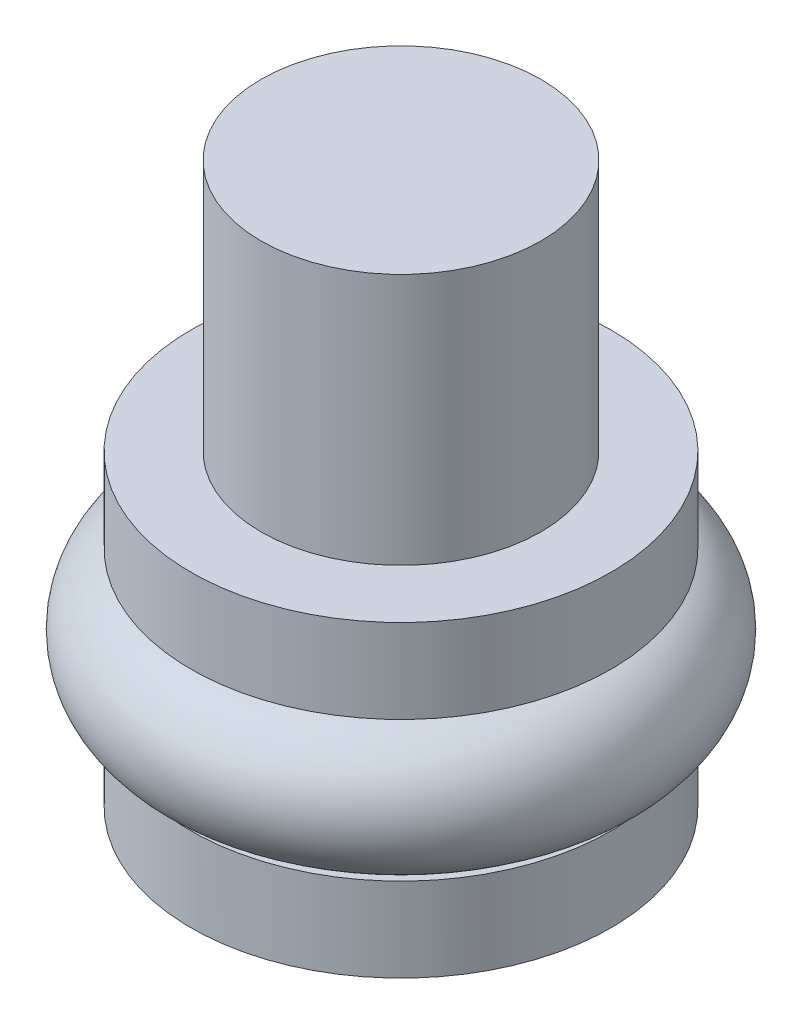
ISO-10303-21;
HEADER;
FILE_DESCRIPTION(('STEP AP214'),'2;1');
FILE_NAME('part.step','',(''),(''),'','','');
FILE_SCHEMA(('AUTOMOTIVE_DESIGN { 1 0 10303 214 1 1 1 1 }'));
ENDSEC;
DATA;
#1=APPLICATION_CONTEXT('core data for automotive mechanical design processes');
#2=APPLICATION_PROTOCOL_DEFINITION('international standard','automotive_design',2000,#1);
#3=PRODUCT_CONTEXT('',#1,'mechanical');
#4=PRODUCT('Part','Part','',(#3));
#5=PRODUCT_RELATED_PRODUCT_CATEGORY('part','',(#4));
#6=PRODUCT_DEFINITION_FORMATION('','',#4);
#7=PRODUCT_DEFINITION_CONTEXT('part definition',#1,'design');
#8=PRODUCT_DEFINITION('design','',#6,#7);
#9=PRODUCT_DEFINITION_SHAPE('','',#8);
#10=(LENGTH_UNIT() NAMED_UNIT(*) SI_UNIT(.MILLI.,.METRE.));
#11=(NAMED_UNIT(*) PLANE_ANGLE_UNIT() SI_UNIT($,.RADIAN.));
#12=(NAMED_UNIT(*) SI_UNIT($,.STERADIAN.) SOLID_ANGLE_UNIT());
#13=UNCERTAINTY_MEASURE_WITH_UNIT(LENGTH_MEASURE(1.E-05),#10,'distance_accuracy_value','');
#14=(GEOMETRIC_REPRESENTATION_CONTEXT(3) GLOBAL_UNCERTAINTY_ASSIGNED_CONTEXT((#13)) GLOBAL_UNIT_ASSIGNED_CONTEXT((#10,
#11,#12)) REPRESENTATION_CONTEXT('',''));
#15=CARTESIAN_POINT('',(0.,0.,0.));
#16=DIRECTION('',(0.,0.,1.));
#17=DIRECTION('',(1.,0.,0.));
#18=AXIS2_PLACEMENT_3D('',#15,#16,#17);
#19=CARTESIAN_POINT('',(0.,-11.,0.));
#20=DIRECTION('',(0.,1.,0.));
#21=DIRECTION('',(0.,0.,1.));
#22=AXIS2_PLACEMENT_3D('',#19,#20,#21);
#23=CYLINDRICAL_SURFACE('',#22,7.5);
#24=CARTESIAN_POINT('',(0.,-11.,0.));
#25=DIRECTION('',(0.,-1.,0.));
#26=DIRECTION('',(0.,0.,-1.));
#27=AXIS2_PLACEMENT_3D('',#24,#25,#26);
#28=CIRCLE('',#27,7.5);
#29=CARTESIAN_POINT('',(0.,-11.,-7.5));
#30=VERTEX_POINT('',#29);
#31=EDGE_CURVE('E12',#30,#30,#28,.T.);
#32=ORIENTED_EDGE('',*,*,#31,.F.);
#33=EDGE_LOOP('',(#32));
#34=FACE_BOUND('',#33,.T.);
#35=CARTESIAN_POINT('',(0.,-8.,0.));
#36=DIRECTION('',(0.,-1.,0.));
#37=DIRECTION('',(0.,0.,-1.));
#38=AXIS2_PLACEMENT_3D('',#35,#36,#37);
#39=CIRCLE('',#38,7.5);
#40=CARTESIAN_POINT('',(0.,-8.,-7.5));
#41=VERTEX_POINT('',#40);
#42=EDGE_CURVE('E45',#41,#41,#39,.T.);
#43=ORIENTED_EDGE('',*,*,#42,.T.);
#44=EDGE_LOOP('',(#43));
#45=FACE_BOUND('',#44,.T.);
#46=ADVANCED_FACE('F42',(#34,#45),#23,.T.);
#47=CARTESIAN_POINT('',(0.,-8.,0.));
#48=DIRECTION('',(0.,-1.,0.));
#49=DIRECTION('',(0.,0.,-1.));
#50=AXIS2_PLACEMENT_3D('',#47,#48,#49);
#51=PLANE('',#50);
#52=ORIENTED_EDGE('',*,*,#42,.F.);
#53=EDGE_LOOP('',(#52));
#54=FACE_BOUND('',#53,.T.);
#55=ADVANCED_FACE('F53',(#54),#51,.F.);
#56=CARTESIAN_POINT('',(0.,-13.,0.));
#57=DIRECTION('',(0.,1.,0.));
#58=DIRECTION('',(-1.,0.,0.));
#59=AXIS2_PLACEMENT_3D('',#56,#57,#58);
#60=CONICAL_SURFACE('',#59,0.,1.31019393504756);
#61=ORIENTED_EDGE('',*,*,#31,.T.);
#62=EDGE_LOOP('',(#61));
#63=FACE_BOUND('',#62,.T.);
#64=CARTESIAN_POINT('',(0.,-13.,0.));
#65=VERTEX_POINT('',#64);
#66=VERTEX_LOOP('',#65);
#67=FACE_BOUND('',#66,.T.);
#68=ADVANCED_FACE('F51',(#63,#67),#60,.T.);
#69=CLOSED_SHELL('',(#46,#55,#68));
#70=MANIFOLD_SOLID_BREP('B2',#69);
#71=CARTESIAN_POINT('',(0.,-5.5,0.));
#72=DIRECTION('',(0.,-1.,0.));
#73=DIRECTION('',(0.,0.,-1.));
#74=AXIS2_PLACEMENT_3D('',#71,#72,#73);
#75=TOROIDAL_SURFACE('',#74,6.5,2.46111070557315);
#76=CARTESIAN_POINT('',(0.,-5.5,6.5));
#77=DIRECTION('',(1.,0.,0.));
#78=DIRECTION('',(0.,0.,-1.));
#79=AXIS2_PLACEMENT_3D('',#76,#77,#78);
#80=CIRCLE('',#79,2.46111070557315);
#81=CARTESIAN_POINT('',(0.,-5.5,8.96111070557315));
#82=VERTEX_POINT('',#81);
#83=EDGE_CURVE('E41',#82,#82,#80,.T.);
#84=CARTESIAN_POINT('',(0.,-5.5,0.));
#85=DIRECTION('',(0.,-1.,0.));
#86=DIRECTION('',(0.,0.,-1.));
#87=AXIS2_PLACEMENT_3D('',#84,#85,#86);
#88=CIRCLE('',#87,8.96111070557315);
#89=EDGE_CURVE('',#82,#82,#88,.T.);
#90=ORIENTED_EDGE('',*,*,#83,.F.);
#91=ORIENTED_EDGE('',*,*,#83,.T.);
#92=ORIENTED_EDGE('',*,*,#89,.T.);
#93=ORIENTED_EDGE('',*,*,#89,.F.);
#94=EDGE_LOOP('',(#90,#92,#91,#93));
#95=FACE_BOUND('',#94,.T.);
#96=ADVANCED_FACE('F92',(#95),#75,.T.);
#97=CLOSED_SHELL('',(#96));
#98=MANIFOLD_SOLID_BREP('B6',#97);
#99=CARTESIAN_POINT('',(0.,9.,0.));
#100=DIRECTION('',(0.,-1.,0.));
#101=DIRECTION('',(0.,0.,-1.));
#102=AXIS2_PLACEMENT_3D('',#99,#100,#101);
#103=CYLINDRICAL_SURFACE('',#102,5.);
#104=CARTESIAN_POINT('',(0.,9.,0.));
#105=DIRECTION('',(0.,1.,0.));
#106=DIRECTION('',(0.,0.,1.));
#107=AXIS2_PLACEMENT_3D('',#104,#105,#106);
#108=CIRCLE('',#107,5.);
#109=CARTESIAN_POINT('',(0.,9.,5.));
#110=VERTEX_POINT('',#109);
#111=EDGE_CURVE('E91',#110,#110,#108,.T.);
#112=ORIENTED_EDGE('',*,*,#111,.F.);
#113=EDGE_LOOP('',(#112));
#114=FACE_BOUND('',#113,.T.);
#115=CARTESIAN_POINT('',(0.,0.,0.));
#116=DIRECTION('',(0.,-1.,0.));
#117=DIRECTION('',(0.,0.,-1.));
#118=AXIS2_PLACEMENT_3D('',#115,#116,#117);
#119=CIRCLE('',#118,5.);
#120=CARTESIAN_POINT('',(0.,0.,-5.));
#121=VERTEX_POINT('',#120);
#122=EDGE_CURVE('E115',#121,#121,#119,.T.);
#123=ORIENTED_EDGE('',*,*,#122,.F.);
#124=EDGE_LOOP('',(#123));
#125=FACE_BOUND('',#124,.T.);
#126=ADVANCED_FACE('F109',(#114,#125),#103,.T.);
#127=CARTESIAN_POINT('',(0.,9.,0.));
#128=DIRECTION('',(0.,1.,0.));
#129=DIRECTION('',(0.,0.,1.));
#130=AXIS2_PLACEMENT_3D('',#127,#128,#129);
#131=PLANE('',#130);
#132=ORIENTED_EDGE('',*,*,#111,.T.);
#133=EDGE_LOOP('',(#132));
#134=FACE_BOUND('',#133,.T.);
#135=ADVANCED_FACE('F142',(#134),#131,.T.);
#136=CARTESIAN_POINT('',(0.,-3.,0.));
#137=DIRECTION('',(0.,1.,0.));
#138=DIRECTION('',(0.,0.,1.));
#139=AXIS2_PLACEMENT_3D('',#136,#137,#138);
#140=CYLINDRICAL_SURFACE('',#139,7.5);
#141=CARTESIAN_POINT('',(0.,-3.,0.));
#142=DIRECTION('',(0.,-1.,0.));
#143=DIRECTION('',(0.,0.,-1.));
#144=AXIS2_PLACEMENT_3D('',#141,#142,#143);
#145=CIRCLE('',#144,7.5);
#146=CARTESIAN_POINT('',(0.,-3.,-7.5));
#147=VERTEX_POINT('',#146);
#148=EDGE_CURVE('E119',#147,#147,#145,.T.);
#149=ORIENTED_EDGE('',*,*,#148,.F.);
#150=EDGE_LOOP('',(#149));
#151=FACE_BOUND('',#150,.T.);
#152=CARTESIAN_POINT('',(0.,0.,0.));
#153=DIRECTION('',(0.,-1.,0.));
#154=DIRECTION('',(0.,0.,-1.));
#155=AXIS2_PLACEMENT_3D('',#152,#153,#154);
#156=CIRCLE('',#155,7.5);
#157=CARTESIAN_POINT('',(0.,0.,-7.5));
#158=VERTEX_POINT('',#157);
#159=EDGE_CURVE('E123',#158,#158,#156,.T.);
#160=ORIENTED_EDGE('',*,*,#159,.T.);
#161=EDGE_LOOP('',(#160));
#162=FACE_BOUND('',#161,.T.);
#163=ADVANCED_FACE('F129',(#151,#162),#140,.T.);
#164=CARTESIAN_POINT('',(0.,-3.,0.));
#165=DIRECTION('',(0.,-1.,0.));
#166=DIRECTION('',(0.,0.,-1.));
#167=AXIS2_PLACEMENT_3D('',#164,#165,#166);
#168=PLANE('',#167);
#169=ORIENTED_EDGE('',*,*,#148,.T.);
#170=EDGE_LOOP('',(#169));
#171=FACE_BOUND('',#170,.T.);
#172=ADVANCED_FACE('F133',(#171),#168,.T.);
#173=CARTESIAN_POINT('',(0.,0.,0.));
#174=DIRECTION('',(0.,-1.,0.));
#175=DIRECTION('',(0.,0.,-1.));
#176=AXIS2_PLACEMENT_3D('',#173,#174,#175);
#177=PLANE('',#176);
#178=ORIENTED_EDGE('',*,*,#122,.T.);
#179=EDGE_LOOP('',(#178));
#180=FACE_BOUND('',#179,.T.);
#181=ORIENTED_EDGE('',*,*,#159,.F.);
#182=EDGE_LOOP('',(#181));
#183=FACE_BOUND('',#182,.T.);
#184=ADVANCED_FACE('F131',(#180,#183),#177,.F.);
#185=CLOSED_SHELL('',(#126,#135,#163,#172,#184));
#186=MANIFOLD_SOLID_BREP('B36',#185);
#187=ADVANCED_BREP_SHAPE_REPRESENTATION('',(#18,#70,#98,#186),#14);
#188=SHAPE_DEFINITION_REPRESENTATION(#9,#187);
ENDSEC;
END-ISO-10303-21;
